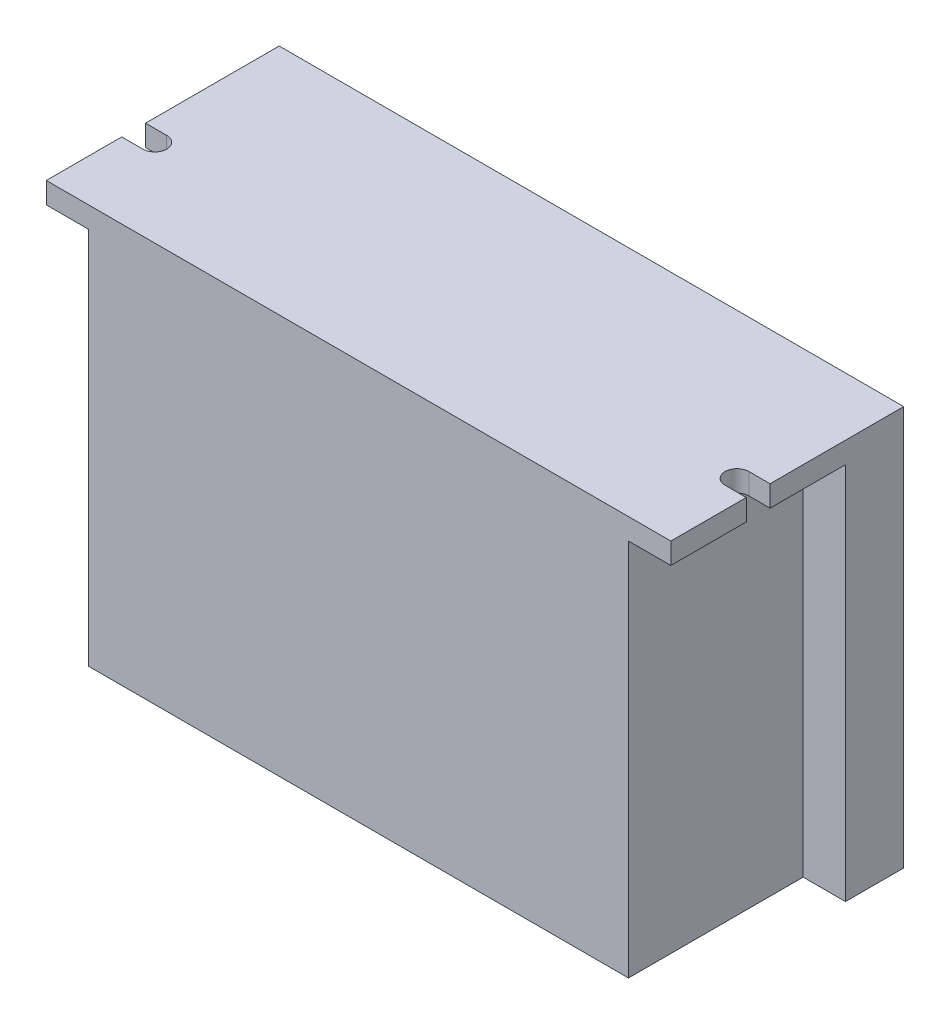
ISO-10303-21;
HEADER;
FILE_DESCRIPTION(('STEP AP214'),'2;1');
FILE_NAME('part.step','',(''),(''),'','','');
FILE_SCHEMA(('AUTOMOTIVE_DESIGN { 1 0 10303 214 1 1 1 1 }'));
ENDSEC;
DATA;
#1=APPLICATION_CONTEXT('core data for automotive mechanical design processes');
#2=APPLICATION_PROTOCOL_DEFINITION('international standard','automotive_design',2000,#1);
#3=PRODUCT_CONTEXT('',#1,'mechanical');
#4=PRODUCT('Part','Part','',(#3));
#5=PRODUCT_RELATED_PRODUCT_CATEGORY('part','',(#4));
#6=PRODUCT_DEFINITION_FORMATION('','',#4);
#7=PRODUCT_DEFINITION_CONTEXT('part definition',#1,'design');
#8=PRODUCT_DEFINITION('design','',#6,#7);
#9=PRODUCT_DEFINITION_SHAPE('','',#8);
#10=(LENGTH_UNIT() NAMED_UNIT(*) SI_UNIT(.MILLI.,.METRE.));
#11=(NAMED_UNIT(*) PLANE_ANGLE_UNIT() SI_UNIT($,.RADIAN.));
#12=(NAMED_UNIT(*) SI_UNIT($,.STERADIAN.) SOLID_ANGLE_UNIT());
#13=UNCERTAINTY_MEASURE_WITH_UNIT(LENGTH_MEASURE(1.E-05),#10,'distance_accuracy_value','');
#14=(GEOMETRIC_REPRESENTATION_CONTEXT(3) GLOBAL_UNCERTAINTY_ASSIGNED_CONTEXT((#13)) GLOBAL_UNIT_ASSIGNED_CONTEXT((#10,
#11,#12)) REPRESENTATION_CONTEXT('',''));
#15=CARTESIAN_POINT('',(0.,0.,0.));
#16=DIRECTION('',(0.,0.,1.));
#17=DIRECTION('',(1.,0.,0.));
#18=AXIS2_PLACEMENT_3D('',#15,#16,#17);
#19=CARTESIAN_POINT('',(-64.596837944664,31.3656126482213,11.));
#20=DIRECTION('',(1.,0.,0.));
#21=DIRECTION('',(0.,1.,0.));
#22=AXIS2_PLACEMENT_3D('',#19,#20,#21);
#23=PLANE('',#22);
#24=DIRECTION('',(0.,0.,-1.));
#25=VECTOR('',#24,1.);
#26=CARTESIAN_POINT('',(-64.596837944664,31.3656126482213,11.));
#27=LINE('',#26,#25);
#28=CARTESIAN_POINT('',(-64.596837944664,31.3656126482213,44.));
#29=VERTEX_POINT('',#28);
#30=CARTESIAN_POINT('',(-64.596837944664,31.3656126482213,29.75));
#31=VERTEX_POINT('',#30);
#32=EDGE_CURVE('E193',#29,#31,#27,.T.);
#33=ORIENTED_EDGE('',*,*,#32,.T.);
#34=DIRECTION('',(0.,-1.,0.));
#35=VECTOR('',#34,1.);
#36=CARTESIAN_POINT('',(-64.596837944664,31.3666126482213,29.75));
#37=LINE('',#36,#35);
#38=CARTESIAN_POINT('',(-64.596837944664,27.3656126482213,29.75));
#39=VERTEX_POINT('',#38);
#40=EDGE_CURVE('E176',#31,#39,#37,.T.);
#41=ORIENTED_EDGE('',*,*,#40,.T.);
#42=DIRECTION('',(0.,0.,-1.));
#43=VECTOR('',#42,1.);
#44=CARTESIAN_POINT('',(-64.596837944664,27.3656126482213,44.));
#45=LINE('',#44,#43);
#46=CARTESIAN_POINT('',(-64.596837944664,27.3656126482213,44.));
#47=VERTEX_POINT('',#46);
#48=EDGE_CURVE('E232',#47,#39,#45,.T.);
#49=ORIENTED_EDGE('',*,*,#48,.F.);
#50=DIRECTION('',(0.,-1.,0.));
#51=VECTOR('',#50,1.);
#52=CARTESIAN_POINT('',(-64.596837944664,27.3656126482213,44.));
#53=LINE('',#52,#51);
#54=EDGE_CURVE('E267',#29,#47,#53,.T.);
#55=ORIENTED_EDGE('',*,*,#54,.F.);
#56=EDGE_LOOP('',(#33,#41,#49,#55));
#57=FACE_BOUND('',#56,.T.);
#58=ADVANCED_FACE('F41',(#57),#23,.F.);
#59=CARTESIAN_POINT('',(53.403162055336,31.3656126482213,11.));
#60=DIRECTION('',(-1.,0.,0.));
#61=DIRECTION('',(0.,0.,1.));
#62=AXIS2_PLACEMENT_3D('',#59,#60,#61);
#63=PLANE('',#62);
#64=DIRECTION('',(0.,0.,-1.));
#65=VECTOR('',#64,1.);
#66=CARTESIAN_POINT('',(53.403162055336,31.3656126482213,11.));
#67=LINE('',#66,#65);
#68=CARTESIAN_POINT('',(53.403162055336,31.3656126482213,25.25));
#69=VERTEX_POINT('',#68);
#70=CARTESIAN_POINT('',(53.403162055336,31.3656126482213,0.));
#71=VERTEX_POINT('',#70);
#72=EDGE_CURVE('E199',#69,#71,#67,.T.);
#73=ORIENTED_EDGE('',*,*,#72,.F.);
#74=DIRECTION('',(0.,-1.,0.));
#75=VECTOR('',#74,1.);
#76=CARTESIAN_POINT('',(53.403162055336,31.3666126482213,25.25));
#77=LINE('',#76,#75);
#78=CARTESIAN_POINT('',(53.403162055336,27.3656126482213,25.25));
#79=VERTEX_POINT('',#78);
#80=EDGE_CURVE('E309',#69,#79,#77,.T.);
#81=ORIENTED_EDGE('',*,*,#80,.T.);
#82=DIRECTION('',(0.,0.,-1.));
#83=VECTOR('',#82,1.);
#84=CARTESIAN_POINT('',(53.403162055336,27.3656126482213,44.));
#85=LINE('',#84,#83);
#86=CARTESIAN_POINT('',(53.403162055336,27.3656126482213,11.));
#87=VERTEX_POINT('',#86);
#88=EDGE_CURVE('E262',#79,#87,#85,.T.);
#89=ORIENTED_EDGE('',*,*,#88,.T.);
#90=DIRECTION('',(0.,1.,0.));
#91=VECTOR('',#90,1.);
#92=CARTESIAN_POINT('',(53.403162055336,31.3656126482213,11.));
#93=LINE('',#92,#91);
#94=CARTESIAN_POINT('',(53.403162055336,-44.1343873517786,11.));
#95=VERTEX_POINT('',#94);
#96=EDGE_CURVE('E194',#95,#87,#93,.T.);
#97=ORIENTED_EDGE('',*,*,#96,.F.);
#98=DIRECTION('',(0.,0.,-1.));
#99=VECTOR('',#98,1.);
#100=CARTESIAN_POINT('',(53.403162055336,-44.1343873517786,11.));
#101=LINE('',#100,#99);
#102=CARTESIAN_POINT('',(53.403162055336,-44.1343873517786,0.));
#103=VERTEX_POINT('',#102);
#104=EDGE_CURVE('E50',#95,#103,#101,.T.);
#105=ORIENTED_EDGE('',*,*,#104,.T.);
#106=DIRECTION('',(0.,1.,0.));
#107=VECTOR('',#106,1.);
#108=CARTESIAN_POINT('',(53.403162055336,31.3656126482213,0.));
#109=LINE('',#108,#107);
#110=EDGE_CURVE('E218',#103,#71,#109,.T.);
#111=ORIENTED_EDGE('',*,*,#110,.T.);
#112=EDGE_LOOP('',(#73,#81,#89,#97,#105,#111));
#113=FACE_BOUND('',#112,.T.);
#114=ADVANCED_FACE('F217',(#113),#63,.F.);
#115=CARTESIAN_POINT('',(0.,0.,11.));
#116=DIRECTION('',(0.,0.,1.));
#117=DIRECTION('',(1.,0.,0.));
#118=AXIS2_PLACEMENT_3D('',#115,#116,#117);
#119=PLANE('',#118);
#120=DIRECTION('',(1.,0.,0.));
#121=VECTOR('',#120,1.);
#122=CARTESIAN_POINT('',(53.403162055336,27.3656126482213,11.));
#123=LINE('',#122,#121);
#124=CARTESIAN_POINT('',(45.403162055336,27.3656126482213,11.));
#125=VERTEX_POINT('',#124);
#126=EDGE_CURVE('E263',#125,#87,#123,.T.);
#127=ORIENTED_EDGE('',*,*,#126,.F.);
#128=DIRECTION('',(0.,1.,0.));
#129=VECTOR('',#128,1.);
#130=CARTESIAN_POINT('',(45.403162055336,27.3656126482213,11.));
#131=LINE('',#130,#129);
#132=CARTESIAN_POINT('',(45.403162055336,-44.1343873517786,11.));
#133=VERTEX_POINT('',#132);
#134=EDGE_CURVE('E268',#133,#125,#131,.T.);
#135=ORIENTED_EDGE('',*,*,#134,.F.);
#136=DIRECTION('',(1.,0.,0.));
#137=VECTOR('',#136,1.);
#138=CARTESIAN_POINT('',(-64.596837944664,-44.1343873517786,11.));
#139=LINE('',#138,#137);
#140=EDGE_CURVE('E236',#133,#95,#139,.T.);
#141=ORIENTED_EDGE('',*,*,#140,.T.);
#142=ORIENTED_EDGE('',*,*,#96,.T.);
#143=EDGE_LOOP('',(#127,#135,#141,#142));
#144=FACE_BOUND('',#143,.T.);
#145=ADVANCED_FACE('F420',(#144),#119,.T.);
#146=CARTESIAN_POINT('',(-64.596837944664,27.3656126482213,25.25));
#147=VERTEX_POINT('',#146);
#148=CARTESIAN_POINT('',(-64.596837944664,27.3656126482213,11.));
#149=VERTEX_POINT('',#148);
#150=EDGE_CURVE('E184',#147,#149,#45,.T.);
#151=ORIENTED_EDGE('',*,*,#150,.F.);
#152=DIRECTION('',(0.,-1.,0.));
#153=VECTOR('',#152,1.);
#154=CARTESIAN_POINT('',(-64.596837944664,31.3666126482213,25.25));
#155=LINE('',#154,#153);
#156=CARTESIAN_POINT('',(-64.596837944664,31.3656126482213,25.25));
#157=VERTEX_POINT('',#156);
#158=EDGE_CURVE('E57',#157,#147,#155,.T.);
#159=ORIENTED_EDGE('',*,*,#158,.F.);
#160=CARTESIAN_POINT('',(-64.596837944664,31.3656126482213,0.));
#161=VERTEX_POINT('',#160);
#162=EDGE_CURVE('E181',#157,#161,#27,.T.);
#163=ORIENTED_EDGE('',*,*,#162,.T.);
#164=DIRECTION('',(0.,-1.,0.));
#165=VECTOR('',#164,1.);
#166=CARTESIAN_POINT('',(-64.596837944664,31.3656126482213,0.));
#167=LINE('',#166,#165);
#168=CARTESIAN_POINT('',(-64.596837944664,-44.1343873517786,0.));
#169=VERTEX_POINT('',#168);
#170=EDGE_CURVE('E228',#161,#169,#167,.T.);
#171=ORIENTED_EDGE('',*,*,#170,.T.);
#172=DIRECTION('',(0.,0.,-1.));
#173=VECTOR('',#172,1.);
#174=CARTESIAN_POINT('',(-64.596837944664,-44.1343873517786,11.));
#175=LINE('',#174,#173);
#176=CARTESIAN_POINT('',(-64.596837944664,-44.1343873517786,11.));
#177=VERTEX_POINT('',#176);
#178=EDGE_CURVE('E11',#177,#169,#175,.T.);
#179=ORIENTED_EDGE('',*,*,#178,.F.);
#180=DIRECTION('',(0.,-1.,0.));
#181=VECTOR('',#180,1.);
#182=CARTESIAN_POINT('',(-64.596837944664,31.3656126482213,11.));
#183=LINE('',#182,#181);
#184=EDGE_CURVE('E227',#149,#177,#183,.T.);
#185=ORIENTED_EDGE('',*,*,#184,.F.);
#186=EDGE_LOOP('',(#151,#159,#163,#171,#179,#185));
#187=FACE_BOUND('',#186,.T.);
#188=ADVANCED_FACE('F43',(#187),#23,.F.);
#189=CARTESIAN_POINT('',(-64.596837944664,-44.1343873517786,11.));
#190=DIRECTION('',(0.,1.,0.));
#191=DIRECTION('',(0.,0.,1.));
#192=AXIS2_PLACEMENT_3D('',#189,#190,#191);
#193=PLANE('',#192);
#194=DIRECTION('',(1.,0.,0.));
#195=VECTOR('',#194,1.);
#196=CARTESIAN_POINT('',(-64.596837944664,-44.1343873517786,0.));
#197=LINE('',#196,#195);
#198=EDGE_CURVE('E223',#169,#103,#197,.T.);
#199=ORIENTED_EDGE('',*,*,#198,.T.);
#200=ORIENTED_EDGE('',*,*,#104,.F.);
#201=ORIENTED_EDGE('',*,*,#140,.F.);
#202=DIRECTION('',(0.,0.,-1.));
#203=VECTOR('',#202,1.);
#204=CARTESIAN_POINT('',(45.403162055336,-44.1343873517786,44.));
#205=LINE('',#204,#203);
#206=CARTESIAN_POINT('',(45.403162055336,-44.1343873517786,44.));
#207=VERTEX_POINT('',#206);
#208=EDGE_CURVE('E250',#207,#133,#205,.T.);
#209=ORIENTED_EDGE('',*,*,#208,.F.);
#210=DIRECTION('',(1.,0.,0.));
#211=VECTOR('',#210,1.);
#212=CARTESIAN_POINT('',(45.403162055336,-44.1343873517786,44.));
#213=LINE('',#212,#211);
#214=CARTESIAN_POINT('',(-56.596837944664,-44.1343873517787,44.));
#215=VERTEX_POINT('',#214);
#216=EDGE_CURVE('E293',#215,#207,#213,.T.);
#217=ORIENTED_EDGE('',*,*,#216,.F.);
#218=DIRECTION('',(0.,0.,-1.));
#219=VECTOR('',#218,1.);
#220=CARTESIAN_POINT('',(-56.596837944664,-44.1343873517787,44.));
#221=LINE('',#220,#219);
#222=CARTESIAN_POINT('',(-56.596837944664,-44.1343873517786,11.));
#223=VERTEX_POINT('',#222);
#224=EDGE_CURVE('E246',#215,#223,#221,.T.);
#225=ORIENTED_EDGE('',*,*,#224,.T.);
#226=EDGE_CURVE('E201',#177,#223,#139,.T.);
#227=ORIENTED_EDGE('',*,*,#226,.F.);
#228=ORIENTED_EDGE('',*,*,#178,.T.);
#229=EDGE_LOOP('',(#199,#200,#201,#209,#217,#225,#227,#228));
#230=FACE_BOUND('',#229,.T.);
#231=ADVANCED_FACE('F400',(#230),#193,.F.);
#232=CARTESIAN_POINT('',(53.403162055336,27.3656126482213,44.));
#233=VERTEX_POINT('',#232);
#234=CARTESIAN_POINT('',(53.403162055336,27.3656126482213,29.75));
#235=VERTEX_POINT('',#234);
#236=EDGE_CURVE('E258',#233,#235,#85,.T.);
#237=ORIENTED_EDGE('',*,*,#236,.T.);
#238=DIRECTION('',(0.,-1.,0.));
#239=VECTOR('',#238,1.);
#240=CARTESIAN_POINT('',(53.403162055336,31.3666126482213,29.75));
#241=LINE('',#240,#239);
#242=CARTESIAN_POINT('',(53.403162055336,31.3656126482213,29.75));
#243=VERTEX_POINT('',#242);
#244=EDGE_CURVE('E65',#243,#235,#241,.T.);
#245=ORIENTED_EDGE('',*,*,#244,.F.);
#246=CARTESIAN_POINT('',(53.403162055336,31.3656126482213,44.));
#247=VERTEX_POINT('',#246);
#248=EDGE_CURVE('E206',#247,#243,#67,.T.);
#249=ORIENTED_EDGE('',*,*,#248,.F.);
#250=DIRECTION('',(0.,1.,0.));
#251=VECTOR('',#250,1.);
#252=CARTESIAN_POINT('',(53.403162055336,31.3656126482213,44.));
#253=LINE('',#252,#251);
#254=EDGE_CURVE('E283',#233,#247,#253,.T.);
#255=ORIENTED_EDGE('',*,*,#254,.F.);
#256=EDGE_LOOP('',(#237,#245,#249,#255));
#257=FACE_BOUND('',#256,.T.);
#258=ADVANCED_FACE('F376',(#257),#63,.F.);
#259=CARTESIAN_POINT('',(-64.596837944664,31.3656126482213,11.));
#260=DIRECTION('',(0.,-1.,0.));
#261=DIRECTION('',(0.,0.,-1.));
#262=AXIS2_PLACEMENT_3D('',#259,#260,#261);
#263=PLANE('',#262);
#264=CARTESIAN_POINT('',(-60.596837944664,31.3656126482213,27.5));
#265=DIRECTION('',(0.,-1.,0.));
#266=DIRECTION('',(0.,0.,-1.));
#267=AXIS2_PLACEMENT_3D('',#264,#265,#266);
#268=CIRCLE('',#267,2.25);
#269=CARTESIAN_POINT('',(-60.596837944664,31.3656126482213,29.75));
#270=VERTEX_POINT('',#269);
#271=CARTESIAN_POINT('',(-60.596837944664,31.3656126482213,25.25));
#272=VERTEX_POINT('',#271);
#273=EDGE_CURVE('E308',#270,#272,#268,.F.);
#274=ORIENTED_EDGE('',*,*,#273,.F.);
#275=DIRECTION('',(1.,0.,0.));
#276=VECTOR('',#275,1.);
#277=CARTESIAN_POINT('',(-64.596837944664,31.3656126482213,29.75));
#278=LINE('',#277,#276);
#279=EDGE_CURVE('E356',#31,#270,#278,.T.);
#280=ORIENTED_EDGE('',*,*,#279,.F.);
#281=ORIENTED_EDGE('',*,*,#32,.F.);
#282=DIRECTION('',(-1.,0.,0.));
#283=VECTOR('',#282,1.);
#284=CARTESIAN_POINT('',(-64.596837944664,31.3656126482213,44.));
#285=LINE('',#284,#283);
#286=EDGE_CURVE('E279',#247,#29,#285,.T.);
#287=ORIENTED_EDGE('',*,*,#286,.F.);
#288=ORIENTED_EDGE('',*,*,#248,.T.);
#289=DIRECTION('',(1.,0.,0.));
#290=VECTOR('',#289,1.);
#291=CARTESIAN_POINT('',(53.403162055336,31.3656126482213,29.75));
#292=LINE('',#291,#290);
#293=CARTESIAN_POINT('',(49.403162055336,31.3656126482213,29.75));
#294=VERTEX_POINT('',#293);
#295=EDGE_CURVE('E305',#294,#243,#292,.T.);
#296=ORIENTED_EDGE('',*,*,#295,.F.);
#297=CARTESIAN_POINT('',(49.403162055336,31.3656126482213,27.5));
#298=DIRECTION('',(0.,-1.,0.));
#299=DIRECTION('',(0.,0.,-1.));
#300=AXIS2_PLACEMENT_3D('',#297,#298,#299);
#301=CIRCLE('',#300,2.25);
#302=CARTESIAN_POINT('',(49.403162055336,31.3656126482213,25.25));
#303=VERTEX_POINT('',#302);
#304=EDGE_CURVE('E335',#303,#294,#301,.F.);
#305=ORIENTED_EDGE('',*,*,#304,.F.);
#306=DIRECTION('',(-1.,0.,0.));
#307=VECTOR('',#306,1.);
#308=CARTESIAN_POINT('',(53.403162055336,31.3656126482213,25.25));
#309=LINE('',#308,#307);
#310=EDGE_CURVE('E331',#69,#303,#309,.T.);
#311=ORIENTED_EDGE('',*,*,#310,.F.);
#312=ORIENTED_EDGE('',*,*,#72,.T.);
#313=DIRECTION('',(-1.,0.,0.));
#314=VECTOR('',#313,1.);
#315=CARTESIAN_POINT('',(-64.596837944664,31.3656126482213,0.));
#316=LINE('',#315,#314);
#317=EDGE_CURVE('E190',#71,#161,#316,.T.);
#318=ORIENTED_EDGE('',*,*,#317,.T.);
#319=ORIENTED_EDGE('',*,*,#162,.F.);
#320=DIRECTION('',(-1.,0.,0.));
#321=VECTOR('',#320,1.);
#322=CARTESIAN_POINT('',(-64.596837944664,31.3656126482213,25.25));
#323=LINE('',#322,#321);
#324=EDGE_CURVE('E167',#272,#157,#323,.T.);
#325=ORIENTED_EDGE('',*,*,#324,.F.);
#326=EDGE_LOOP('',(#274,#280,#281,#287,#288,#296,#305,#311,#312,#318,#319,#325));
#327=FACE_BOUND('',#326,.T.);
#328=ADVANCED_FACE('F188',(#327),#263,.F.);
#329=DIRECTION('',(0.,-1.,0.));
#330=VECTOR('',#329,1.);
#331=CARTESIAN_POINT('',(-56.596837944664,-44.1343873517787,11.));
#332=LINE('',#331,#330);
#333=CARTESIAN_POINT('',(-56.596837944664,27.3656126482213,11.));
#334=VERTEX_POINT('',#333);
#335=EDGE_CURVE('E272',#334,#223,#332,.T.);
#336=ORIENTED_EDGE('',*,*,#335,.F.);
#337=DIRECTION('',(1.,0.,0.));
#338=VECTOR('',#337,1.);
#339=CARTESIAN_POINT('',(-56.596837944664,27.3656126482213,11.));
#340=LINE('',#339,#338);
#341=EDGE_CURVE('E175',#149,#334,#340,.T.);
#342=ORIENTED_EDGE('',*,*,#341,.F.);
#343=ORIENTED_EDGE('',*,*,#184,.T.);
#344=ORIENTED_EDGE('',*,*,#226,.T.);
#345=EDGE_LOOP('',(#336,#342,#343,#344));
#346=FACE_BOUND('',#345,.T.);
#347=ADVANCED_FACE('F397',(#346),#119,.T.);
#348=CARTESIAN_POINT('',(0.,0.,0.));
#349=DIRECTION('',(0.,0.,1.));
#350=DIRECTION('',(1.,0.,0.));
#351=AXIS2_PLACEMENT_3D('',#348,#349,#350);
#352=PLANE('',#351);
#353=ORIENTED_EDGE('',*,*,#170,.F.);
#354=ORIENTED_EDGE('',*,*,#317,.F.);
#355=ORIENTED_EDGE('',*,*,#110,.F.);
#356=ORIENTED_EDGE('',*,*,#198,.F.);
#357=EDGE_LOOP('',(#353,#354,#355,#356));
#358=FACE_BOUND('',#357,.T.);
#359=ADVANCED_FACE('F222',(#358),#352,.F.);
#360=CARTESIAN_POINT('',(-56.596837944664,27.3656126482213,44.));
#361=DIRECTION('',(0.,1.,0.));
#362=DIRECTION('',(0.,0.,1.));
#363=AXIS2_PLACEMENT_3D('',#360,#361,#362);
#364=PLANE('',#363);
#365=ORIENTED_EDGE('',*,*,#48,.T.);
#366=DIRECTION('',(-1.,0.,0.));
#367=VECTOR('',#366,1.);
#368=CARTESIAN_POINT('',(-64.596837944664,27.3656126482213,29.75));
#369=LINE('',#368,#367);
#370=CARTESIAN_POINT('',(-60.596837944664,27.3656126482213,29.75));
#371=VERTEX_POINT('',#370);
#372=EDGE_CURVE('E186',#371,#39,#369,.T.);
#373=ORIENTED_EDGE('',*,*,#372,.F.);
#374=CARTESIAN_POINT('',(-60.596837944664,27.3656126482213,27.5));
#375=DIRECTION('',(0.,-1.,0.));
#376=DIRECTION('',(0.,0.,-1.));
#377=AXIS2_PLACEMENT_3D('',#374,#375,#376);
#378=CIRCLE('',#377,2.25);
#379=CARTESIAN_POINT('',(-60.596837944664,27.3656126482213,25.25));
#380=VERTEX_POINT('',#379);
#381=EDGE_CURVE('E349',#380,#371,#378,.T.);
#382=ORIENTED_EDGE('',*,*,#381,.F.);
#383=DIRECTION('',(1.,0.,0.));
#384=VECTOR('',#383,1.);
#385=CARTESIAN_POINT('',(-64.596837944664,27.3656126482213,25.25));
#386=LINE('',#385,#384);
#387=EDGE_CURVE('E353',#147,#380,#386,.T.);
#388=ORIENTED_EDGE('',*,*,#387,.F.);
#389=ORIENTED_EDGE('',*,*,#150,.T.);
#390=ORIENTED_EDGE('',*,*,#341,.T.);
#391=DIRECTION('',(0.,0.,-1.));
#392=VECTOR('',#391,1.);
#393=CARTESIAN_POINT('',(-56.596837944664,27.3656126482213,44.));
#394=LINE('',#393,#392);
#395=CARTESIAN_POINT('',(-56.596837944664,27.3656126482213,44.));
#396=VERTEX_POINT('',#395);
#397=EDGE_CURVE('E242',#396,#334,#394,.T.);
#398=ORIENTED_EDGE('',*,*,#397,.F.);
#399=DIRECTION('',(1.,0.,0.));
#400=VECTOR('',#399,1.);
#401=CARTESIAN_POINT('',(-56.596837944664,27.3656126482213,44.));
#402=LINE('',#401,#400);
#403=EDGE_CURVE('E299',#47,#396,#402,.T.);
#404=ORIENTED_EDGE('',*,*,#403,.F.);
#405=EDGE_LOOP('',(#365,#373,#382,#388,#389,#390,#398,#404));
#406=FACE_BOUND('',#405,.T.);
#407=ADVANCED_FACE('F394',(#406),#364,.F.);
#408=CARTESIAN_POINT('',(-56.596837944664,-44.1343873517787,44.));
#409=DIRECTION('',(1.,0.,0.));
#410=DIRECTION('',(0.,1.,0.));
#411=AXIS2_PLACEMENT_3D('',#408,#409,#410);
#412=PLANE('',#411);
#413=ORIENTED_EDGE('',*,*,#335,.T.);
#414=ORIENTED_EDGE('',*,*,#224,.F.);
#415=DIRECTION('',(0.,-1.,0.));
#416=VECTOR('',#415,1.);
#417=CARTESIAN_POINT('',(-56.596837944664,-44.1343873517787,44.));
#418=LINE('',#417,#416);
#419=EDGE_CURVE('E296',#396,#215,#418,.T.);
#420=ORIENTED_EDGE('',*,*,#419,.F.);
#421=ORIENTED_EDGE('',*,*,#397,.T.);
#422=EDGE_LOOP('',(#413,#414,#420,#421));
#423=FACE_BOUND('',#422,.T.);
#424=ADVANCED_FACE('F404',(#423),#412,.F.);
#425=CARTESIAN_POINT('',(45.403162055336,27.3656126482213,44.));
#426=DIRECTION('',(-1.,0.,0.));
#427=DIRECTION('',(0.,-1.,0.));
#428=AXIS2_PLACEMENT_3D('',#425,#426,#427);
#429=PLANE('',#428);
#430=ORIENTED_EDGE('',*,*,#134,.T.);
#431=DIRECTION('',(0.,0.,-1.));
#432=VECTOR('',#431,1.);
#433=CARTESIAN_POINT('',(45.403162055336,27.3656126482213,44.));
#434=LINE('',#433,#432);
#435=CARTESIAN_POINT('',(45.403162055336,27.3656126482213,44.));
#436=VERTEX_POINT('',#435);
#437=EDGE_CURVE('E254',#436,#125,#434,.T.);
#438=ORIENTED_EDGE('',*,*,#437,.F.);
#439=DIRECTION('',(0.,1.,0.));
#440=VECTOR('',#439,1.);
#441=CARTESIAN_POINT('',(45.403162055336,27.3656126482213,44.));
#442=LINE('',#441,#440);
#443=EDGE_CURVE('E290',#207,#436,#442,.T.);
#444=ORIENTED_EDGE('',*,*,#443,.F.);
#445=ORIENTED_EDGE('',*,*,#208,.T.);
#446=EDGE_LOOP('',(#430,#438,#444,#445));
#447=FACE_BOUND('',#446,.T.);
#448=ADVANCED_FACE('F468',(#447),#429,.F.);
#449=CARTESIAN_POINT('',(53.403162055336,27.3656126482213,44.));
#450=DIRECTION('',(0.,1.,0.));
#451=DIRECTION('',(0.,0.,1.));
#452=AXIS2_PLACEMENT_3D('',#449,#450,#451);
#453=PLANE('',#452);
#454=ORIENTED_EDGE('',*,*,#88,.F.);
#455=DIRECTION('',(1.,0.,0.));
#456=VECTOR('',#455,1.);
#457=CARTESIAN_POINT('',(53.403162055336,27.3656126482213,25.25));
#458=LINE('',#457,#456);
#459=CARTESIAN_POINT('',(49.403162055336,27.3656126482213,25.25));
#460=VERTEX_POINT('',#459);
#461=EDGE_CURVE('E313',#460,#79,#458,.T.);
#462=ORIENTED_EDGE('',*,*,#461,.F.);
#463=CARTESIAN_POINT('',(49.403162055336,27.3656126482213,27.5));
#464=DIRECTION('',(0.,-1.,0.));
#465=DIRECTION('',(0.,0.,1.));
#466=AXIS2_PLACEMENT_3D('',#463,#464,#465);
#467=CIRCLE('',#466,2.25);
#468=CARTESIAN_POINT('',(49.403162055336,27.3656126482213,29.75));
#469=VERTEX_POINT('',#468);
#470=EDGE_CURVE('E324',#469,#460,#467,.T.);
#471=ORIENTED_EDGE('',*,*,#470,.F.);
#472=DIRECTION('',(-1.,0.,0.));
#473=VECTOR('',#472,1.);
#474=CARTESIAN_POINT('',(53.403162055336,27.3656126482213,29.75));
#475=LINE('',#474,#473);
#476=EDGE_CURVE('E328',#235,#469,#475,.T.);
#477=ORIENTED_EDGE('',*,*,#476,.F.);
#478=ORIENTED_EDGE('',*,*,#236,.F.);
#479=DIRECTION('',(1.,0.,0.));
#480=VECTOR('',#479,1.);
#481=CARTESIAN_POINT('',(53.403162055336,27.3656126482213,44.));
#482=LINE('',#481,#480);
#483=EDGE_CURVE('E287',#436,#233,#482,.T.);
#484=ORIENTED_EDGE('',*,*,#483,.F.);
#485=ORIENTED_EDGE('',*,*,#437,.T.);
#486=ORIENTED_EDGE('',*,*,#126,.T.);
#487=EDGE_LOOP('',(#454,#462,#471,#477,#478,#484,#485,#486));
#488=FACE_BOUND('',#487,.T.);
#489=ADVANCED_FACE('F381',(#488),#453,.F.);
#490=CARTESIAN_POINT('',(0.,0.,44.));
#491=DIRECTION('',(0.,0.,-1.));
#492=DIRECTION('',(-1.,0.,0.));
#493=AXIS2_PLACEMENT_3D('',#490,#491,#492);
#494=PLANE('',#493);
#495=ORIENTED_EDGE('',*,*,#54,.T.);
#496=ORIENTED_EDGE('',*,*,#403,.T.);
#497=ORIENTED_EDGE('',*,*,#419,.T.);
#498=ORIENTED_EDGE('',*,*,#216,.T.);
#499=ORIENTED_EDGE('',*,*,#443,.T.);
#500=ORIENTED_EDGE('',*,*,#483,.T.);
#501=ORIENTED_EDGE('',*,*,#254,.T.);
#502=ORIENTED_EDGE('',*,*,#286,.T.);
#503=EDGE_LOOP('',(#495,#496,#497,#498,#499,#500,#501,#502));
#504=FACE_BOUND('',#503,.T.);
#505=ADVANCED_FACE('F370',(#504),#494,.F.);
#506=CARTESIAN_POINT('',(53.403162055336,31.3666126482213,25.25));
#507=DIRECTION('',(0.,0.,-1.));
#508=DIRECTION('',(-1.,0.,0.));
#509=AXIS2_PLACEMENT_3D('',#506,#507,#508);
#510=PLANE('',#509);
#511=ORIENTED_EDGE('',*,*,#310,.T.);
#512=DIRECTION('',(0.,-1.,0.));
#513=VECTOR('',#512,1.);
#514=CARTESIAN_POINT('',(49.403162055336,31.3666126482213,25.25));
#515=LINE('',#514,#513);
#516=EDGE_CURVE('E316',#303,#460,#515,.T.);
#517=ORIENTED_EDGE('',*,*,#516,.T.);
#518=ORIENTED_EDGE('',*,*,#461,.T.);
#519=ORIENTED_EDGE('',*,*,#80,.F.);
#520=EDGE_LOOP('',(#511,#517,#518,#519));
#521=FACE_BOUND('',#520,.T.);
#522=ADVANCED_FACE('F489',(#521),#510,.F.);
#523=CARTESIAN_POINT('',(49.403162055336,31.3666126482213,27.5));
#524=DIRECTION('',(0.,-1.,0.));
#525=DIRECTION('',(0.,0.,-1.));
#526=AXIS2_PLACEMENT_3D('',#523,#524,#525);
#527=CYLINDRICAL_SURFACE('',#526,2.25);
#528=ORIENTED_EDGE('',*,*,#304,.T.);
#529=DIRECTION('',(0.,-1.,0.));
#530=VECTOR('',#529,1.);
#531=CARTESIAN_POINT('',(49.403162055336,31.3666126482213,29.75));
#532=LINE('',#531,#530);
#533=EDGE_CURVE('E312',#294,#469,#532,.T.);
#534=ORIENTED_EDGE('',*,*,#533,.T.);
#535=ORIENTED_EDGE('',*,*,#470,.T.);
#536=ORIENTED_EDGE('',*,*,#516,.F.);
#537=EDGE_LOOP('',(#528,#534,#535,#536));
#538=FACE_BOUND('',#537,.T.);
#539=ADVANCED_FACE('F386',(#538),#527,.F.);
#540=CARTESIAN_POINT('',(53.403162055336,31.3666126482213,29.75));
#541=DIRECTION('',(0.,0.,1.));
#542=DIRECTION('',(1.,0.,0.));
#543=AXIS2_PLACEMENT_3D('',#540,#541,#542);
#544=PLANE('',#543);
#545=ORIENTED_EDGE('',*,*,#295,.T.);
#546=ORIENTED_EDGE('',*,*,#244,.T.);
#547=ORIENTED_EDGE('',*,*,#476,.T.);
#548=ORIENTED_EDGE('',*,*,#533,.F.);
#549=EDGE_LOOP('',(#545,#546,#547,#548));
#550=FACE_BOUND('',#549,.T.);
#551=ADVANCED_FACE('F384',(#550),#544,.F.);
#552=CARTESIAN_POINT('',(-64.596837944664,31.3666126482213,29.75));
#553=DIRECTION('',(0.,0.,1.));
#554=DIRECTION('',(1.,0.,0.));
#555=AXIS2_PLACEMENT_3D('',#552,#553,#554);
#556=PLANE('',#555);
#557=ORIENTED_EDGE('',*,*,#279,.T.);
#558=DIRECTION('',(0.,-1.,0.));
#559=VECTOR('',#558,1.);
#560=CARTESIAN_POINT('',(-60.596837944664,31.3666126482213,29.75));
#561=LINE('',#560,#559);
#562=EDGE_CURVE('E341',#270,#371,#561,.T.);
#563=ORIENTED_EDGE('',*,*,#562,.T.);
#564=ORIENTED_EDGE('',*,*,#372,.T.);
#565=ORIENTED_EDGE('',*,*,#40,.F.);
#566=EDGE_LOOP('',(#557,#563,#564,#565));
#567=FACE_BOUND('',#566,.T.);
#568=ADVANCED_FACE('F407',(#567),#556,.F.);
#569=CARTESIAN_POINT('',(-60.596837944664,31.3666126482213,27.5));
#570=DIRECTION('',(0.,-1.,0.));
#571=DIRECTION('',(0.,0.,-1.));
#572=AXIS2_PLACEMENT_3D('',#569,#570,#571);
#573=CYLINDRICAL_SURFACE('',#572,2.25);
#574=ORIENTED_EDGE('',*,*,#273,.T.);
#575=DIRECTION('',(0.,-1.,0.));
#576=VECTOR('',#575,1.);
#577=CARTESIAN_POINT('',(-60.596837944664,31.3666126482213,25.25));
#578=LINE('',#577,#576);
#579=EDGE_CURVE('E169',#272,#380,#578,.T.);
#580=ORIENTED_EDGE('',*,*,#579,.T.);
#581=ORIENTED_EDGE('',*,*,#381,.T.);
#582=ORIENTED_EDGE('',*,*,#562,.F.);
#583=EDGE_LOOP('',(#574,#580,#581,#582));
#584=FACE_BOUND('',#583,.T.);
#585=ADVANCED_FACE('F362',(#584),#573,.F.);
#586=CARTESIAN_POINT('',(-64.596837944664,31.3666126482213,25.25));
#587=DIRECTION('',(0.,0.,-1.));
#588=DIRECTION('',(-1.,0.,0.));
#589=AXIS2_PLACEMENT_3D('',#586,#587,#588);
#590=PLANE('',#589);
#591=ORIENTED_EDGE('',*,*,#324,.T.);
#592=ORIENTED_EDGE('',*,*,#158,.T.);
#593=ORIENTED_EDGE('',*,*,#387,.T.);
#594=ORIENTED_EDGE('',*,*,#579,.F.);
#595=EDGE_LOOP('',(#591,#592,#593,#594));
#596=FACE_BOUND('',#595,.T.);
#597=ADVANCED_FACE('F168',(#596),#590,.F.);
#598=CLOSED_SHELL('',(#58,#114,#145,#188,#231,#258,#328,#347,#359,#407,#424,#448,#489,#505,#522,
#539,#551,#568,#585,#597));
#599=MANIFOLD_SOLID_BREP('B2',#598);
#600=ADVANCED_BREP_SHAPE_REPRESENTATION('',(#18,#599),#14);
#601=SHAPE_DEFINITION_REPRESENTATION(#9,#600);
ENDSEC;
END-ISO-10303-21;
